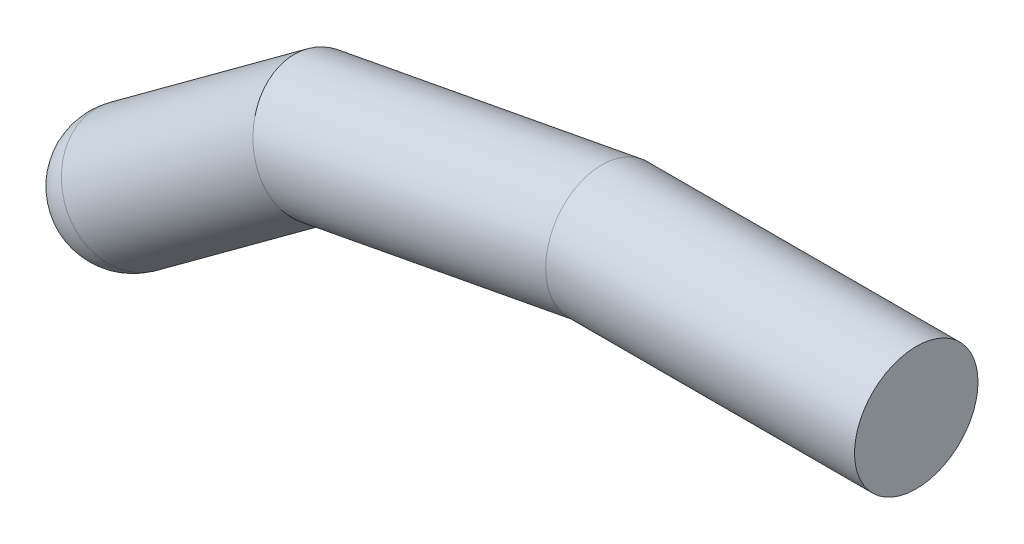
ISO-10303-21;
HEADER;
FILE_DESCRIPTION(('STEP AP214'),'2;1');
FILE_NAME('part.step','',(''),(''),'','','');
FILE_SCHEMA(('AUTOMOTIVE_DESIGN { 1 0 10303 214 1 1 1 1 }'));
ENDSEC;
DATA;
#1=APPLICATION_CONTEXT('core data for automotive mechanical design processes');
#2=APPLICATION_PROTOCOL_DEFINITION('international standard','automotive_design',2000,#1);
#3=PRODUCT_CONTEXT('',#1,'mechanical');
#4=PRODUCT('Part','Part','',(#3));
#5=PRODUCT_RELATED_PRODUCT_CATEGORY('part','',(#4));
#6=PRODUCT_DEFINITION_FORMATION('','',#4);
#7=PRODUCT_DEFINITION_CONTEXT('part definition',#1,'design');
#8=PRODUCT_DEFINITION('design','',#6,#7);
#9=PRODUCT_DEFINITION_SHAPE('','',#8);
#10=(LENGTH_UNIT() NAMED_UNIT(*) SI_UNIT(.MILLI.,.METRE.));
#11=(NAMED_UNIT(*) PLANE_ANGLE_UNIT() SI_UNIT($,.RADIAN.));
#12=(NAMED_UNIT(*) SI_UNIT($,.STERADIAN.) SOLID_ANGLE_UNIT());
#13=UNCERTAINTY_MEASURE_WITH_UNIT(LENGTH_MEASURE(1.E-05),#10,'distance_accuracy_value','');
#14=(GEOMETRIC_REPRESENTATION_CONTEXT(3) GLOBAL_UNCERTAINTY_ASSIGNED_CONTEXT((#13)) GLOBAL_UNIT_ASSIGNED_CONTEXT((#10,
#11,#12)) REPRESENTATION_CONTEXT('',''));
#15=CARTESIAN_POINT('',(0.,0.,0.));
#16=DIRECTION('',(0.,0.,1.));
#17=DIRECTION('',(1.,0.,0.));
#18=AXIS2_PLACEMENT_3D('',#15,#16,#17);
#19=CARTESIAN_POINT('',(0.,0.,0.));
#20=DIRECTION('',(1.,0.,0.));
#21=DIRECTION('',(0.,0.,-1.));
#22=AXIS2_PLACEMENT_3D('',#19,#20,#21);
#23=PLANE('',#22);
#24=CARTESIAN_POINT('',(0.,0.,0.));
#25=DIRECTION('',(1.,0.,0.));
#26=DIRECTION('',(0.,0.,-1.));
#27=AXIS2_PLACEMENT_3D('',#24,#25,#26);
#28=CIRCLE('',#27,4.);
#29=CARTESIAN_POINT('',(0.,0.,-4.));
#30=VERTEX_POINT('',#29);
#31=EDGE_CURVE('E42',#30,#30,#28,.T.);
#32=ORIENTED_EDGE('',*,*,#31,.T.);
#33=EDGE_LOOP('',(#32));
#34=FACE_BOUND('',#33,.T.);
#35=ADVANCED_FACE('F31',(#34),#23,.T.);
#36=CARTESIAN_POINT('',(-36.9770629498807,-2.27844949433425,0.));
#37=DIRECTION('',(-0.805776736373901,-0.592219428184034,0.));
#38=DIRECTION('',(0.592219428184035,-0.805776736373901,0.));
#39=AXIS2_PLACEMENT_3D('',#36,#37,#38);
#40=CYLINDRICAL_SURFACE('',#39,4.);
#41=CARTESIAN_POINT('',(-50.7571606151013,-12.4063685458843,0.));
#42=DIRECTION('',(-0.805776736373901,-0.592219428184034,0.));
#43=DIRECTION('',(0.592219428184035,-0.805776736373901,0.));
#44=AXIS2_PLACEMENT_3D('',#41,#42,#43);
#45=CIRCLE('',#44,4.);
#46=CARTESIAN_POINT('',(-48.3882829023652,-15.6294754913799,0.));
#47=VERTEX_POINT('',#46);
#48=EDGE_CURVE('E10',#47,#47,#45,.F.);
#49=ORIENTED_EDGE('',*,*,#48,.T.);
#50=EDGE_LOOP('',(#49));
#51=FACE_BOUND('',#50,.T.);
#52=CARTESIAN_POINT('',(-38.6705095694928,-3.52307712312381,0.));
#53=DIRECTION('',(-0.917058047121609,-0.398753731279723,0.));
#54=DIRECTION('',(-0.398753731279723,0.917058047121609,0.));
#55=AXIS2_PLACEMENT_3D('',#52,#53,#54);
#56=ELLIPSE('',#55,4.1021696757951,4.);
#57=CARTESIAN_POINT('',(-40.3062650340586,0.238850588722321,0.));
#58=VERTEX_POINT('',#57);
#59=EDGE_CURVE('E47',#58,#58,#56,.T.);
#60=ORIENTED_EDGE('',*,*,#59,.T.);
#61=EDGE_LOOP('',(#60));
#62=FACE_BOUND('',#61,.T.);
#63=ADVANCED_FACE('F52',(#51,#62),#40,.T.);
#64=CARTESIAN_POINT('',(-19.0929997949349,0.171148605303991,0.));
#65=DIRECTION('',(-0.982658398394357,-0.185425111743358,0.));
#66=DIRECTION('',(0.185425111743358,-0.982658398394357,0.));
#67=AXIS2_PLACEMENT_3D('',#64,#65,#66);
#68=CYLINDRICAL_SURFACE('',#67,4.);
#69=CARTESIAN_POINT('',(-20.,0.,0.));
#70=DIRECTION('',(-0.995655160784686,-0.0931171348507967,0.));
#71=DIRECTION('',(-0.0931171348507967,0.995655160784686,0.));
#72=AXIS2_PLACEMENT_3D('',#69,#70,#71);
#73=ELLIPSE('',#72,4.01745519688519,4.);
#74=CARTESIAN_POINT('',(-20.3740939173254,4.,0.));
#75=VERTEX_POINT('',#74);
#76=EDGE_CURVE('E38',#75,#75,#73,.T.);
#77=ORIENTED_EDGE('',*,*,#76,.T.);
#78=EDGE_LOOP('',(#77));
#79=FACE_BOUND('',#78,.T.);
#80=ORIENTED_EDGE('',*,*,#59,.F.);
#81=EDGE_LOOP('',(#80));
#82=FACE_BOUND('',#81,.T.);
#83=ADVANCED_FACE('F54',(#79,#82),#68,.T.);
#84=CARTESIAN_POINT('',(0.,0.,0.));
#85=DIRECTION('',(-1.,0.,0.));
#86=DIRECTION('',(0.,-1.,0.));
#87=AXIS2_PLACEMENT_3D('',#84,#85,#86);
#88=CYLINDRICAL_SURFACE('',#87,4.);
#89=ORIENTED_EDGE('',*,*,#31,.F.);
#90=EDGE_LOOP('',(#89));
#91=FACE_BOUND('',#90,.T.);
#92=ORIENTED_EDGE('',*,*,#76,.F.);
#93=EDGE_LOOP('',(#92));
#94=FACE_BOUND('',#93,.T.);
#95=ADVANCED_FACE('F56',(#91,#94),#88,.T.);
#96=CARTESIAN_POINT('',(-50.7571606151013,-12.4063685458843,0.));
#97=DIRECTION('',(0.805776736373901,0.592219428184034,0.));
#98=DIRECTION('',(-0.592219428184034,0.805776736373901,0.));
#99=AXIS2_PLACEMENT_3D('',#96,#97,#98);
#100=SPHERICAL_SURFACE('',#99,4.);
#101=ORIENTED_EDGE('',*,*,#48,.F.);
#102=EDGE_LOOP('',(#101));
#103=FACE_BOUND('',#102,.T.);
#104=ADVANCED_FACE('F33',(#103),#100,.T.);
#105=CLOSED_SHELL('',(#35,#63,#83,#95,#104));
#106=MANIFOLD_SOLID_BREP('B2',#105);
#107=ADVANCED_BREP_SHAPE_REPRESENTATION('',(#18,#106),#14);
#108=SHAPE_DEFINITION_REPRESENTATION(#9,#107);
ENDSEC;
END-ISO-10303-21;
